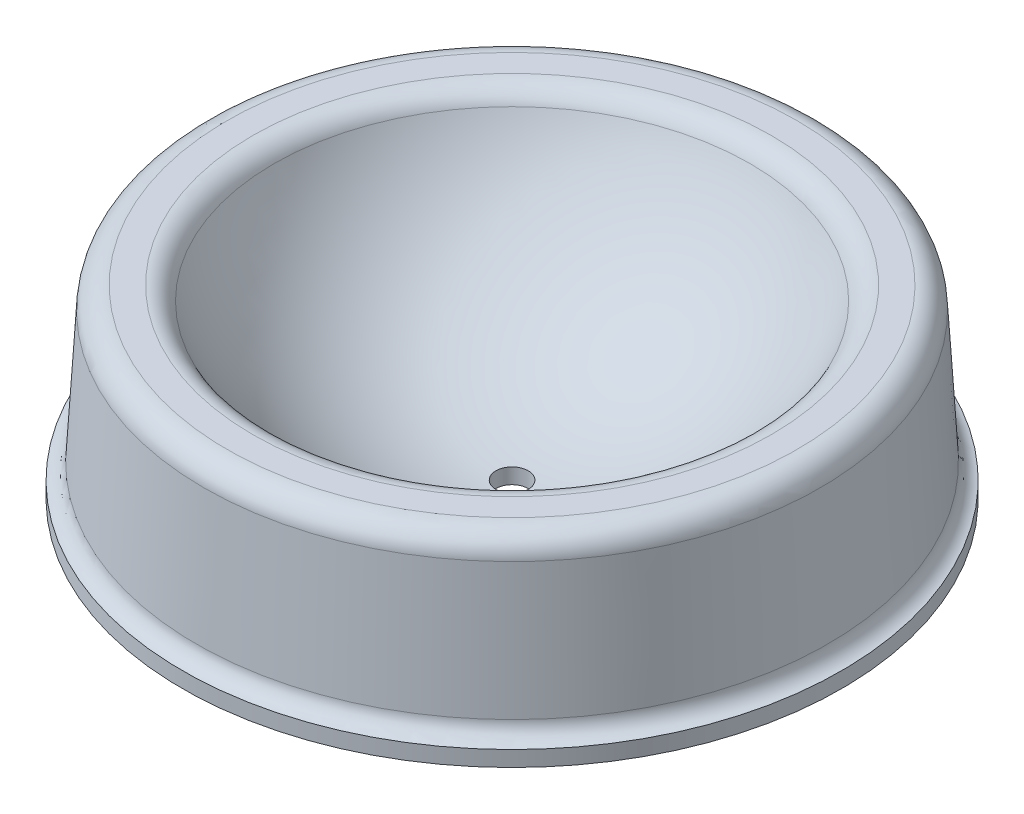
ISO-10303-21;
HEADER;
FILE_DESCRIPTION(('STEP AP214'),'2;1');
FILE_NAME('part.step','',(''),(''),'','','');
FILE_SCHEMA(('AUTOMOTIVE_DESIGN { 1 0 10303 214 1 1 1 1 }'));
ENDSEC;
DATA;
#1=APPLICATION_CONTEXT('core data for automotive mechanical design processes');
#2=APPLICATION_PROTOCOL_DEFINITION('international standard','automotive_design',2000,#1);
#3=PRODUCT_CONTEXT('',#1,'mechanical');
#4=PRODUCT('Part','Part','',(#3));
#5=PRODUCT_RELATED_PRODUCT_CATEGORY('part','',(#4));
#6=PRODUCT_DEFINITION_FORMATION('','',#4);
#7=PRODUCT_DEFINITION_CONTEXT('part definition',#1,'design');
#8=PRODUCT_DEFINITION('design','',#6,#7);
#9=PRODUCT_DEFINITION_SHAPE('','',#8);
#10=(LENGTH_UNIT() NAMED_UNIT(*) SI_UNIT(.MILLI.,.METRE.));
#11=(NAMED_UNIT(*) PLANE_ANGLE_UNIT() SI_UNIT($,.RADIAN.));
#12=(NAMED_UNIT(*) SI_UNIT($,.STERADIAN.) SOLID_ANGLE_UNIT());
#13=UNCERTAINTY_MEASURE_WITH_UNIT(LENGTH_MEASURE(1.E-05),#10,'distance_accuracy_value','');
#14=(GEOMETRIC_REPRESENTATION_CONTEXT(3) GLOBAL_UNCERTAINTY_ASSIGNED_CONTEXT((#13)) GLOBAL_UNIT_ASSIGNED_CONTEXT((#10,
#11,#12)) REPRESENTATION_CONTEXT('',''));
#15=CARTESIAN_POINT('',(0.,0.,0.));
#16=DIRECTION('',(0.,0.,1.));
#17=DIRECTION('',(1.,0.,0.));
#18=AXIS2_PLACEMENT_3D('',#15,#16,#17);
#19=CARTESIAN_POINT('',(0.,17.875,0.));
#20=DIRECTION('',(0.,-1.,0.));
#21=DIRECTION('',(1.,0.,0.));
#22=AXIS2_PLACEMENT_3D('',#19,#20,#21);
#23=SPHERICAL_SURFACE('',#22,16.875);
#24=CARTESIAN_POINT('',(0.,11.1020408163265,0.));
#25=DIRECTION('',(0.,-1.,0.));
#26=DIRECTION('',(0.,0.,-1.));
#27=AXIS2_PLACEMENT_3D('',#24,#25,#26);
#28=CIRCLE('',#27,15.4561524609553);
#29=CARTESIAN_POINT('',(15.4561524609553,11.1020408163265,0.));
#30=VERTEX_POINT('',#29);
#31=EDGE_CURVE('E71',#30,#30,#28,.T.);
#32=CARTESIAN_POINT('',(0.,1.03269834612858,0.));
#33=DIRECTION('',(0.,1.,0.));
#34=DIRECTION('',(0.,0.,1.));
#35=AXIS2_PLACEMENT_3D('',#32,#33,#34);
#36=CIRCLE('',#35,1.05);
#37=CARTESIAN_POINT('',(1.04999999999995,1.03269834612858,0.));
#38=VERTEX_POINT('',#37);
#39=EDGE_CURVE('E95',#38,#38,#36,.T.);
#40=CARTESIAN_POINT('',(15.4561524609553,11.1020408163265,0.));
#41=CARTESIAN_POINT('',(15.3788621076636,10.9256578126866,0.));
#42=CARTESIAN_POINT('',(15.2985500335209,10.750599031239,0.));
#43=CARTESIAN_POINT('',(15.1319820587863,10.4033324371645,0.));
#44=CARTESIAN_POINT('',(15.0457261581943,10.2311246245376,0.));
#45=CARTESIAN_POINT('',(14.8673701458141,9.88976249254047,0.));
#46=CARTESIAN_POINT('',(14.7752700340259,9.7206081731703,0.));
#47=CARTESIAN_POINT('',(14.5853339301025,9.38555107832429,0.));
#48=CARTESIAN_POINT('',(14.4874979379674,9.21964830284846,0.));
#49=CARTESIAN_POINT('',(14.2862046262202,8.89128877567911,0.));
#50=CARTESIAN_POINT('',(14.1827473066079,8.72883202398558,0.));
#51=CARTESIAN_POINT('',(13.9703326146798,8.40755492143563,0.));
#52=CARTESIAN_POINT('',(13.8613752423639,8.24873457057921,0.));
#53=CARTESIAN_POINT('',(13.6380881296626,7.9349164023137,0.));
#54=CARTESIAN_POINT('',(13.5237583892772,7.77991858490462,0.));
#55=CARTESIAN_POINT('',(13.2898605308209,7.47392713172405,0.));
#56=CARTESIAN_POINT('',(13.17029241275,7.32293349595256,0.));
#57=CARTESIAN_POINT('',(12.9260579258276,7.02512736278692,0.));
#58=CARTESIAN_POINT('',(12.8013915569762,6.87831486539276,0.));
#59=CARTESIAN_POINT('',(12.5471066709662,6.58904306531929,0.));
#60=CARTESIAN_POINT('',(12.4174881538076,6.44658376263997,0.));
#61=CARTESIAN_POINT('',(12.1534508771249,6.16618530671068,0.));
#62=CARTESIAN_POINT('',(12.0190321176008,6.02824615346071,0.));
#63=CARTESIAN_POINT('',(11.7455518878062,5.75704965370709,0.));
#64=CARTESIAN_POINT('',(11.6064904175357,5.62379230720343,0.));
#65=CARTESIAN_POINT('',(11.3238877388629,5.36211559143827,0.));
#66=CARTESIAN_POINT('',(11.1803465304607,5.23369622217676,0.));
#67=CARTESIAN_POINT('',(10.8889525981569,4.98184596153902,0.));
#68=CARTESIAN_POINT('',(10.7410998742552,4.85841507016279,0.));
#69=CARTESIAN_POINT('',(10.4412561864498,4.61668641970948,0.));
#70=CARTESIAN_POINT('',(10.289265222546,4.4983886606324,0.));
#71=CARTESIAN_POINT('',(9.98132318002992,4.26706491343419,0.));
#72=CARTESIAN_POINT('',(9.82537210141771,4.15403892531306,0.));
#73=CARTESIAN_POINT('',(9.50969259582161,3.93339118044953,0.));
#74=CARTESIAN_POINT('',(9.34996416883771,3.82576942370713,0.));
#75=CARTESIAN_POINT('',(9.02691715968556,3.6160562685532,0.));
#76=CARTESIAN_POINT('',(8.8635985775173,3.51396487014166,0.));
#77=CARTESIAN_POINT('',(8.5335626586539,3.31543207731703,0.));
#78=CARTESIAN_POINT('',(8.36684532195876,3.21899068290393,0.));
#79=CARTESIAN_POINT('',(8.03020727785792,3.03187092224045,0.));
#80=CARTESIAN_POINT('',(7.86028657045222,2.94119255599008,0.));
#81=CARTESIAN_POINT('',(7.5174409229259,2.76570512185613,0.));
#82=CARTESIAN_POINT('',(7.34451598280529,2.68089605397255,0.));
#83=CARTESIAN_POINT('',(6.99586452864549,2.51724660826805,0.));
#84=CARTESIAN_POINT('',(6.8201380146063,2.43840623044713,0.));
#85=CARTESIAN_POINT('',(6.46608935469933,2.28678656159244,0.));
#86=CARTESIAN_POINT('',(6.28776720883155,2.21400727055866,0.));
#87=CARTESIAN_POINT('',(5.92873626930453,2.07459506867794,0.));
#88=CARTESIAN_POINT('',(5.74802747564531,2.00796215783098,0.));
#89=CARTESIAN_POINT('',(5.38443502157658,1.88092080669852,0.));
#90=CARTESIAN_POINT('',(5.20155136116707,1.82051236641302,0.));
#91=CARTESIAN_POINT('',(4.83382350354045,1.70599075126838,0.));
#92=CARTESIAN_POINT('',(4.64897930632333,1.65187757640926,0.));
#93=CARTESIAN_POINT('',(4.27754700239312,1.55000991211333,0.));
#94=CARTESIAN_POINT('',(4.09095889568004,1.50225542267653,0.));
#95=CARTESIAN_POINT('',(3.71625744486645,1.4131610865602,0.));
#96=CARTESIAN_POINT('',(3.52814410076596,1.37182123988068,0.));
#97=CARTESIAN_POINT('',(3.15061263094592,1.29560466863405,0.));
#98=CARTESIAN_POINT('',(2.96119450522636,1.26072794406695,0.));
#99=CARTESIAN_POINT('',(2.58127547139079,1.19747837403154,0.));
#100=CARTESIAN_POINT('',(2.39077456327477,1.16910552856323,0.));
#101=CARTESIAN_POINT('',(2.00891317938955,1.11889740361295,0.));
#102=CARTESIAN_POINT('',(1.81755270362036,1.09706212413098,0.));
#103=CARTESIAN_POINT('',(1.43419660598941,1.0599530958967,0.));
#104=CARTESIAN_POINT('',(1.24220098412766,1.04467934714439,0.));
#105=CARTESIAN_POINT('',(1.04999999999995,1.03269834612858,0.));
#106=B_SPLINE_CURVE_WITH_KNOTS('',3,(#40,#41,#42,#43,#44,#45,#46,#47,#48,#49,#50,#51,#52,#53,
#54,#55,#56,#57,#58,#59,#60,#61,#62,#63,#64,#65,#66,#67,#68,#69,#70,#71,#72,#73,#74,#75,#76,#77,
#78,#79,#80,#81,#82,#83,#84,#85,#86,#87,#88,#89,#90,#91,#92,#93,#94,#95,#96,#97,#98,#99,#100,
#101,#102,#103,#104,#105),.UNSPECIFIED.,.F.,.F.,(4,2,2,2,2,2,2,2,2,2,2,2,2,2,2,2,2,2,2,2,2,2,2,
2,2,2,2,2,2,2,2,2,4),(0.,0.57769378281613,1.15538756563226,1.73308134844839,2.31077513126452,
2.88846891408065,3.46616269689678,4.04385647971291,4.62155026252904,5.19924404534517,
5.7769378281613,6.35463161097743,6.93232539379356,7.51001917660969,8.08771295942582,
8.66540674224195,9.24310052505808,9.82079430787421,10.3984880906903,10.9761818735065,
11.5538756563226,12.1315694391387,12.7092632219549,13.286957004771,13.8646507875871,
14.4423445704033,15.0200383532194,15.5977321360355,16.1754259188516,16.7531197016678,
17.3308134844839,17.9085072673,18.4862010501162),.UNSPECIFIED.);
#107=EDGE_CURVE('BSEAM39',#30,#38,#106,.T.);
#108=ORIENTED_EDGE('',*,*,#31,.F.);
#109=ORIENTED_EDGE('',*,*,#39,.F.);
#110=ORIENTED_EDGE('',*,*,#107,.T.);
#111=ORIENTED_EDGE('',*,*,#107,.F.);
#112=EDGE_LOOP('',(#108,#110,#109,#111));
#113=FACE_BOUND('',#112,.T.);
#114=ADVANCED_FACE('F39',(#113),#23,.F.);
#115=CARTESIAN_POINT('',(0.,17.875,0.));
#116=DIRECTION('',(0.,-1.,0.));
#117=DIRECTION('',(1.,0.,0.));
#118=AXIS2_PLACEMENT_3D('',#115,#116,#117);
#119=SPHERICAL_SURFACE('',#118,17.875);
#120=CARTESIAN_POINT('',(0.,10.7006802721088,0.));
#121=DIRECTION('',(0.,-1.,0.));
#122=DIRECTION('',(0.,0.,-1.));
#123=AXIS2_PLACEMENT_3D('',#120,#121,#122);
#124=CIRCLE('',#123,16.3720726067896);
#125=CARTESIAN_POINT('',(16.3720726067896,10.7006802721088,0.));
#126=VERTEX_POINT('',#125);
#127=EDGE_CURVE('E75',#126,#126,#124,.T.);
#128=CARTESIAN_POINT('',(0.,0.0308658097401653,0.));
#129=DIRECTION('',(0.,1.,0.));
#130=DIRECTION('',(0.,0.,1.));
#131=AXIS2_PLACEMENT_3D('',#128,#129,#130);
#132=CIRCLE('',#131,1.05);
#133=CARTESIAN_POINT('',(1.04999999999996,0.0308658097401653,0.));
#134=VERTEX_POINT('',#133);
#135=EDGE_CURVE('E98',#134,#134,#132,.F.);
#136=CARTESIAN_POINT('',(16.3720726067896,10.7006802721088,0.));
#137=CARTESIAN_POINT('',(16.2899414829681,10.5132501930312,0.));
#138=CARTESIAN_POINT('',(16.2045891465245,10.3272317612301,0.));
#139=CARTESIAN_POINT('',(16.0275486080402,9.95823475822919,0.));
#140=CARTESIAN_POINT('',(15.9358604059996,9.77525618702935,0.));
#141=CARTESIAN_POINT('',(15.7462546959682,9.41255547127901,0.));
#142=CARTESIAN_POINT('',(15.6483371879775,9.2328333267285,0.));
#143=CARTESIAN_POINT('',(15.4463887749421,8.87685722896369,0.));
#144=CARTESIAN_POINT('',(15.3423578698975,8.70060327574938,0.));
#145=CARTESIAN_POINT('',(15.1283052453954,8.35177149230403,0.));
#146=CARTESIAN_POINT('',(15.018283525938,8.17919366207299,0.));
#147=CARTESIAN_POINT('',(14.792379064689,7.83791765157921,0.));
#148=CARTESIAN_POINT('',(14.6764963228975,7.66921947131646,0.));
#149=CARTESIAN_POINT('',(14.4390064831401,7.33590173049291,0.));
#150=CARTESIAN_POINT('',(14.3173993851742,7.17128216993211,0.));
#151=CARTESIAN_POINT('',(14.0686042609632,6.84631582289273,0.));
#152=CARTESIAN_POINT('',(13.9414162347182,6.68596903641417,0.));
#153=CARTESIAN_POINT('',(13.6816092613308,6.36973735385583,0.));
#154=CARTESIAN_POINT('',(13.5489903141885,6.21385245777605,0.));
#155=CARTESIAN_POINT('',(13.2784779124606,5.90672840953825,0.));
#156=CARTESIAN_POINT('',(13.1405844578751,5.75548925738023,0.));
#157=CARTESIAN_POINT('',(12.8596856753703,5.45783507132585,0.));
#158=CARTESIAN_POINT('',(12.7166803474509,5.31142003742949,0.));
#159=CARTESIAN_POINT('',(12.4257264814812,5.02358677255637,0.));
#160=CARTESIAN_POINT('',(12.2777779434309,4.88216854157962,0.));
#161=CARTESIAN_POINT('',(11.9771121505033,4.60449567388652,0.));
#162=CARTESIAN_POINT('',(11.824394895626,4.46824103717018,0.));
#163=CARTESIAN_POINT('',(11.5143717866676,4.20105605929605,0.));
#164=CARTESIAN_POINT('',(11.3570659325864,4.07012571813826,0.));
#165=CARTESIAN_POINT('',(11.0380511547227,3.81374375310485,0.));
#166=CARTESIAN_POINT('',(10.8763422309402,3.68829212922924,0.));
#167=CARTESIAN_POINT('',(10.5487120362407,3.44301555878078,0.));
#168=CARTESIAN_POINT('',(10.3827907653236,3.32319061220793,0.));
#169=CARTESIAN_POINT('',(10.0469315670435,3.0893087201759,0.));
#170=CARTESIAN_POINT('',(9.87699363968052,2.9752517747167,0.));
#171=CARTESIAN_POINT('',(9.53330155651786,2.75304040583309,0.));
#172=CARTESIAN_POINT('',(9.35954740071821,2.64488598240867,0.));
#173=CARTESIAN_POINT('',(9.00842778962363,2.43460721696955,0.));
#174=CARTESIAN_POINT('',(8.8310623343287,2.33248287495486,0.));
#175=CARTESIAN_POINT('',(8.47292931241999,2.13438471971765,0.));
#176=CARTESIAN_POINT('',(8.2921617458062,2.03841090649513,0.));
#177=CARTESIAN_POINT('',(7.92743770195057,1.85272700217574,0.));
#178=CARTESIAN_POINT('',(7.74348122470873,1.76301691107887,0.));
#179=CARTESIAN_POINT('',(7.37259632134977,1.58996625678755,0.));
#180=CARTESIAN_POINT('',(7.18566789523266,1.5066256935931,0.));
#181=CARTESIAN_POINT('',(6.80905956104724,1.34641238855732,0.));
#182=CARTESIAN_POINT('',(6.61937965297894,1.26953964671598,0.));
#183=CARTESIAN_POINT('',(6.23749206697064,1.1223526495074,0.));
#184=CARTESIAN_POINT('',(6.04528438903064,1.05203839414016,0.));
#185=CARTESIAN_POINT('',(5.65856795663761,0.918051300016874,0.));
#186=CARTESIAN_POINT('',(5.46405920218457,0.854378461260835,0.));
#187=CARTESIAN_POINT('',(5.07297002413375,0.733749296666221,0.));
#188=CARTESIAN_POINT('',(4.87638960053596,0.676792970827647,0.));
#189=CARTESIAN_POINT('',(4.48138893464454,0.569664009845847,0.));
#190=CARTESIAN_POINT('',(4.2829686923509,0.519491374702621,0.));
#191=CARTESIAN_POINT('',(3.88452241049812,0.425988960677927,0.));
#192=CARTESIAN_POINT('',(3.68449637093899,0.382659181796457,0.));
#193=CARTESIAN_POINT('',(3.28307440592063,0.302893617806218,0.));
#194=CARTESIAN_POINT('',(3.0816784804614,0.266457832697447,0.));
#195=CARTESIAN_POINT('',(2.67775428550383,0.200523104099837,0.));
#196=CARTESIAN_POINT('',(2.4752260160055,0.171024160610998,0.));
#197=CARTESIAN_POINT('',(2.06927595500646,0.118998374147032,0.));
#198=CARTESIAN_POINT('',(1.86585416350576,0.0964715311719066,0.));
#199=CARTESIAN_POINT('',(1.4583571408783,0.0584147704030599,0.));
#200=CARTESIAN_POINT('',(1.25428190975156,0.0428848526093389,0.));
#201=CARTESIAN_POINT('',(1.04999999999996,0.0308658097401653,0.));
#202=B_SPLINE_CURVE_WITH_KNOTS('',3,(#136,#137,#138,#139,#140,#141,#142,#143,#144,#145,#146,
#147,#148,#149,#150,#151,#152,#153,#154,#155,#156,#157,#158,#159,#160,#161,#162,#163,#164,#165,
#166,#167,#168,#169,#170,#171,#172,#173,#174,#175,#176,#177,#178,#179,#180,#181,#182,#183,#184,
#185,#186,#187,#188,#189,#190,#191,#192,#193,#194,#195,#196,#197,#198,#199,#200,#201),
.UNSPECIFIED.,.F.,.F.,(4,2,2,2,2,2,2,2,2,2,2,2,2,2,2,2,2,2,2,2,2,2,2,2,2,2,2,2,2,2,2,2,4),(0.,
0.613875213821602,1.2277504276432,1.8416256414648,2.45550085528641,3.06937606910801,
3.68325128292961,4.29712649675121,4.91100171057281,5.52487692439441,6.13875213821601,
6.75262735203761,7.36650256585922,7.98037777968082,8.59425299350242,9.20812820732402,
9.82200342114562,10.4358786349672,11.0497538487888,11.6636290626104,12.277504276432,
12.8913794902536,13.5052547040752,14.1191299178968,14.7330051317184,15.34688034554,
15.9607555593616,16.5746307731832,17.1885059870048,17.8023812008264,18.416256414648,
19.0301316284696,19.6440068422912),.UNSPECIFIED.);
#203=EDGE_CURVE('BSEAM104',#126,#134,#202,.T.);
#204=ORIENTED_EDGE('',*,*,#127,.T.);
#205=ORIENTED_EDGE('',*,*,#135,.F.);
#206=ORIENTED_EDGE('',*,*,#203,.T.);
#207=ORIENTED_EDGE('',*,*,#203,.F.);
#208=EDGE_LOOP('',(#204,#206,#205,#207));
#209=FACE_BOUND('',#208,.T.);
#210=ADVANCED_FACE('F104',(#209),#119,.T.);
#211=CARTESIAN_POINT('',(0.,2.12511841695902,0.));
#212=DIRECTION('',(0.,-1.,0.));
#213=DIRECTION('',(0.,0.,-1.));
#214=AXIS2_PLACEMENT_3D('',#211,#212,#213);
#215=TOROIDAL_SURFACE('',#214,21.6343351757463,2.1379993593756);
#216=CARTESIAN_POINT('',(0.,0.,0.));
#217=DIRECTION('',(0.,-1.,0.));
#218=DIRECTION('',(0.,0.,-1.));
#219=AXIS2_PLACEMENT_3D('',#216,#217,#218);
#220=CIRCLE('',#219,21.4);
#221=CARTESIAN_POINT('',(0.,0.,-21.4));
#222=VERTEX_POINT('',#221);
#223=EDGE_CURVE('E10',#222,#222,#220,.T.);
#224=ORIENTED_EDGE('',*,*,#223,.T.);
#225=EDGE_LOOP('',(#224));
#226=FACE_BOUND('',#225,.T.);
#227=CARTESIAN_POINT('',(0.,2.,0.));
#228=DIRECTION('',(0.,-1.,0.));
#229=DIRECTION('',(0.,0.,-1.));
#230=AXIS2_PLACEMENT_3D('',#227,#228,#229);
#231=CIRCLE('',#230,19.5);
#232=CARTESIAN_POINT('',(0.,2.,-19.5));
#233=VERTEX_POINT('',#232);
#234=EDGE_CURVE('E91',#233,#233,#231,.T.);
#235=ORIENTED_EDGE('',*,*,#234,.F.);
#236=EDGE_LOOP('',(#235));
#237=FACE_BOUND('',#236,.T.);
#238=ADVANCED_FACE('F41',(#226,#237),#215,.T.);
#239=CARTESIAN_POINT('',(0.,0.,0.));
#240=DIRECTION('',(0.,-1.,0.));
#241=DIRECTION('',(0.,0.,-1.));
#242=AXIS2_PLACEMENT_3D('',#239,#240,#241);
#243=CYLINDRICAL_SURFACE('',#242,21.4);
#244=CARTESIAN_POINT('',(0.,1.01150736845635,0.));
#245=DIRECTION('',(0.,-1.,0.));
#246=DIRECTION('',(0.,0.,-1.));
#247=AXIS2_PLACEMENT_3D('',#244,#245,#246);
#248=CIRCLE('',#247,21.4);
#249=CARTESIAN_POINT('',(0.,1.01150736845635,-21.4));
#250=VERTEX_POINT('',#249);
#251=EDGE_CURVE('E47',#250,#250,#248,.T.);
#252=ORIENTED_EDGE('',*,*,#251,.T.);
#253=EDGE_LOOP('',(#252));
#254=FACE_BOUND('',#253,.T.);
#255=ORIENTED_EDGE('',*,*,#223,.F.);
#256=EDGE_LOOP('',(#255));
#257=FACE_BOUND('',#256,.T.);
#258=ADVANCED_FACE('F112',(#254,#257),#243,.T.);
#259=CARTESIAN_POINT('',(0.,2.12511841695902,0.));
#260=DIRECTION('',(0.,-1.,0.));
#261=DIRECTION('',(0.,0.,-1.));
#262=AXIS2_PLACEMENT_3D('',#259,#260,#261);
#263=TOROIDAL_SURFACE('',#262,21.6343351757463,1.1379993593756);
#264=CARTESIAN_POINT('',(0.,2.05852126026622,0.));
#265=DIRECTION('',(0.,-1.,0.));
#266=DIRECTION('',(0.,0.,-1.));
#267=AXIS2_PLACEMENT_3D('',#264,#265,#266);
#268=CIRCLE('',#267,20.4982861624288);
#269=CARTESIAN_POINT('',(0.,2.05852126026622,-20.4982861624288));
#270=VERTEX_POINT('',#269);
#271=EDGE_CURVE('E52',#270,#270,#268,.T.);
#272=ORIENTED_EDGE('',*,*,#271,.T.);
#273=EDGE_LOOP('',(#272));
#274=FACE_BOUND('',#273,.T.);
#275=ORIENTED_EDGE('',*,*,#251,.F.);
#276=EDGE_LOOP('',(#275));
#277=FACE_BOUND('',#276,.T.);
#278=ADVANCED_FACE('F134',(#274,#277),#263,.F.);
#279=CARTESIAN_POINT('',(0.,2.05852126026622,0.));
#280=DIRECTION('',(0.,-1.,0.));
#281=DIRECTION('',(0.,0.,-1.));
#282=AXIS2_PLACEMENT_3D('',#279,#280,#281);
#283=CONICAL_SURFACE('',#282,20.4982861624288,0.0585547151800405);
#284=CARTESIAN_POINT('',(0.,10.5877818903993,0.));
#285=DIRECTION('',(0.,-1.,0.));
#286=DIRECTION('',(0.,0.,-1.));
#287=AXIS2_PLACEMENT_3D('',#284,#285,#286);
#288=CIRCLE('',#287,19.9982861624288);
#289=CARTESIAN_POINT('',(0.,10.5877818903993,-19.9982861624288));
#290=VERTEX_POINT('',#289);
#291=EDGE_CURVE('E57',#290,#290,#288,.T.);
#292=ORIENTED_EDGE('',*,*,#291,.T.);
#293=EDGE_LOOP('',(#292));
#294=FACE_BOUND('',#293,.T.);
#295=ORIENTED_EDGE('',*,*,#271,.F.);
#296=EDGE_LOOP('',(#295));
#297=FACE_BOUND('',#296,.T.);
#298=ADVANCED_FACE('F130',(#294,#297),#283,.T.);
#299=CARTESIAN_POINT('',(0.,10.5,0.));
#300=DIRECTION('',(0.,-1.,0.));
#301=DIRECTION('',(0.,0.,-1.));
#302=AXIS2_PLACEMENT_3D('',#299,#300,#301);
#303=TOROIDAL_SURFACE('',#302,18.5008569187856,1.5);
#304=CARTESIAN_POINT('',(0.,12.,0.));
#305=DIRECTION('',(0.,-1.,0.));
#306=DIRECTION('',(0.,0.,-1.));
#307=AXIS2_PLACEMENT_3D('',#304,#305,#306);
#308=CIRCLE('',#307,18.5008569187856);
#309=CARTESIAN_POINT('',(0.,12.,-18.5008569187856));
#310=VERTEX_POINT('',#309);
#311=EDGE_CURVE('E63',#310,#310,#308,.T.);
#312=ORIENTED_EDGE('',*,*,#311,.T.);
#313=EDGE_LOOP('',(#312));
#314=FACE_BOUND('',#313,.T.);
#315=ORIENTED_EDGE('',*,*,#291,.F.);
#316=EDGE_LOOP('',(#315));
#317=FACE_BOUND('',#316,.T.);
#318=ADVANCED_FACE('F126',(#314,#317),#303,.T.);
#319=CARTESIAN_POINT('',(18.5008569187856,12.,0.));
#320=DIRECTION('',(0.,1.,0.));
#321=DIRECTION('',(0.,0.,1.));
#322=AXIS2_PLACEMENT_3D('',#319,#320,#321);
#323=PLANE('',#322);
#324=CARTESIAN_POINT('',(0.,12.,0.));
#325=DIRECTION('',(0.,-1.,0.));
#326=DIRECTION('',(0.,0.,-1.));
#327=AXIS2_PLACEMENT_3D('',#324,#325,#326);
#328=CIRCLE('',#327,16.8300326797068);
#329=CARTESIAN_POINT('',(0.,12.,-16.8300326797068));
#330=VERTEX_POINT('',#329);
#331=EDGE_CURVE('E67',#330,#330,#328,.T.);
#332=ORIENTED_EDGE('',*,*,#331,.T.);
#333=EDGE_LOOP('',(#332));
#334=FACE_BOUND('',#333,.T.);
#335=ORIENTED_EDGE('',*,*,#311,.F.);
#336=EDGE_LOOP('',(#335));
#337=FACE_BOUND('',#336,.T.);
#338=ADVANCED_FACE('F122',(#334,#337),#323,.T.);
#339=CARTESIAN_POINT('',(0.,10.5,0.));
#340=DIRECTION('',(0.,-1.,0.));
#341=DIRECTION('',(0.,0.,-1.));
#342=AXIS2_PLACEMENT_3D('',#339,#340,#341);
#343=TOROIDAL_SURFACE('',#342,16.8300326797068,1.5);
#344=ORIENTED_EDGE('',*,*,#31,.T.);
#345=EDGE_LOOP('',(#344));
#346=FACE_BOUND('',#345,.T.);
#347=ORIENTED_EDGE('',*,*,#331,.F.);
#348=EDGE_LOOP('',(#347));
#349=FACE_BOUND('',#348,.T.);
#350=ADVANCED_FACE('F119',(#346,#349),#343,.T.);
#351=CARTESIAN_POINT('',(0.,10.5,0.));
#352=DIRECTION('',(0.,-1.,0.));
#353=DIRECTION('',(0.,0.,-1.));
#354=AXIS2_PLACEMENT_3D('',#351,#352,#353);
#355=TOROIDAL_SURFACE('',#354,16.8300326797068,0.500000000000001);
#356=CARTESIAN_POINT('',(0.,11.,0.));
#357=DIRECTION('',(0.,-1.,0.));
#358=DIRECTION('',(0.,0.,-1.));
#359=AXIS2_PLACEMENT_3D('',#356,#357,#358);
#360=CIRCLE('',#359,16.8300326797068);
#361=CARTESIAN_POINT('',(0.,11.,-16.8300326797068));
#362=VERTEX_POINT('',#361);
#363=EDGE_CURVE('E79',#362,#362,#360,.T.);
#364=ORIENTED_EDGE('',*,*,#363,.T.);
#365=EDGE_LOOP('',(#364));
#366=FACE_BOUND('',#365,.T.);
#367=ORIENTED_EDGE('',*,*,#127,.F.);
#368=EDGE_LOOP('',(#367));
#369=FACE_BOUND('',#368,.T.);
#370=ADVANCED_FACE('F116',(#366,#369),#355,.F.);
#371=CARTESIAN_POINT('',(18.5008569187856,11.,0.));
#372=DIRECTION('',(0.,-1.,0.));
#373=DIRECTION('',(0.,0.,-1.));
#374=AXIS2_PLACEMENT_3D('',#371,#372,#373);
#375=PLANE('',#374);
#376=CARTESIAN_POINT('',(0.,11.,0.));
#377=DIRECTION('',(0.,-1.,0.));
#378=DIRECTION('',(0.,0.,-1.));
#379=AXIS2_PLACEMENT_3D('',#376,#377,#378);
#380=CIRCLE('',#379,18.5008569187856);
#381=CARTESIAN_POINT('',(0.,11.,-18.5008569187856));
#382=VERTEX_POINT('',#381);
#383=EDGE_CURVE('E83',#382,#382,#380,.T.);
#384=ORIENTED_EDGE('',*,*,#383,.T.);
#385=EDGE_LOOP('',(#384));
#386=FACE_BOUND('',#385,.T.);
#387=ORIENTED_EDGE('',*,*,#363,.F.);
#388=EDGE_LOOP('',(#387));
#389=FACE_BOUND('',#388,.T.);
#390=ADVANCED_FACE('F170',(#386,#389),#375,.T.);
#391=CARTESIAN_POINT('',(0.,10.5,0.));
#392=DIRECTION('',(0.,-1.,0.));
#393=DIRECTION('',(0.,0.,-1.));
#394=AXIS2_PLACEMENT_3D('',#391,#392,#393);
#395=TOROIDAL_SURFACE('',#394,18.5008569187856,0.5);
#396=CARTESIAN_POINT('',(0.,10.5292606301331,0.));
#397=DIRECTION('',(0.,-1.,0.));
#398=DIRECTION('',(0.,0.,-1.));
#399=AXIS2_PLACEMENT_3D('',#396,#397,#398);
#400=CIRCLE('',#399,19.);
#401=CARTESIAN_POINT('',(0.,10.5292606301331,-19.));
#402=VERTEX_POINT('',#401);
#403=EDGE_CURVE('E87',#402,#402,#400,.T.);
#404=ORIENTED_EDGE('',*,*,#403,.T.);
#405=EDGE_LOOP('',(#404));
#406=FACE_BOUND('',#405,.T.);
#407=ORIENTED_EDGE('',*,*,#383,.F.);
#408=EDGE_LOOP('',(#407));
#409=FACE_BOUND('',#408,.T.);
#410=ADVANCED_FACE('F177',(#406,#409),#395,.F.);
#411=CARTESIAN_POINT('',(0.,10.5292606301331,0.));
#412=DIRECTION('',(0.,-1.,0.));
#413=DIRECTION('',(0.,0.,-1.));
#414=AXIS2_PLACEMENT_3D('',#411,#412,#413);
#415=CONICAL_SURFACE('',#414,19.,0.0585547151800406);
#416=ORIENTED_EDGE('',*,*,#234,.T.);
#417=EDGE_LOOP('',(#416));
#418=FACE_BOUND('',#417,.T.);
#419=ORIENTED_EDGE('',*,*,#403,.F.);
#420=EDGE_LOOP('',(#419));
#421=FACE_BOUND('',#420,.T.);
#422=ADVANCED_FACE('F184',(#418,#421),#415,.F.);
#423=CARTESIAN_POINT('',(0.,12.001,0.));
#424=DIRECTION('',(0.,-1.,0.));
#425=DIRECTION('',(0.,0.,-1.));
#426=AXIS2_PLACEMENT_3D('',#423,#424,#425);
#427=CYLINDRICAL_SURFACE('',#426,1.05);
#428=ORIENTED_EDGE('',*,*,#39,.T.);
#429=EDGE_LOOP('',(#428));
#430=FACE_BOUND('',#429,.T.);
#431=ORIENTED_EDGE('',*,*,#135,.T.);
#432=EDGE_LOOP('',(#431));
#433=FACE_BOUND('',#432,.T.);
#434=ADVANCED_FACE('F102',(#430,#433),#427,.F.);
#435=CLOSED_SHELL('',(#114,#210,#238,#258,#278,#298,#318,#338,#350,#370,#390,#410,#422,#434));
#436=MANIFOLD_SOLID_BREP('B2',#435);
#437=ADVANCED_BREP_SHAPE_REPRESENTATION('',(#18,#436),#14);
#438=SHAPE_DEFINITION_REPRESENTATION(#9,#437);
ENDSEC;
END-ISO-10303-21;
